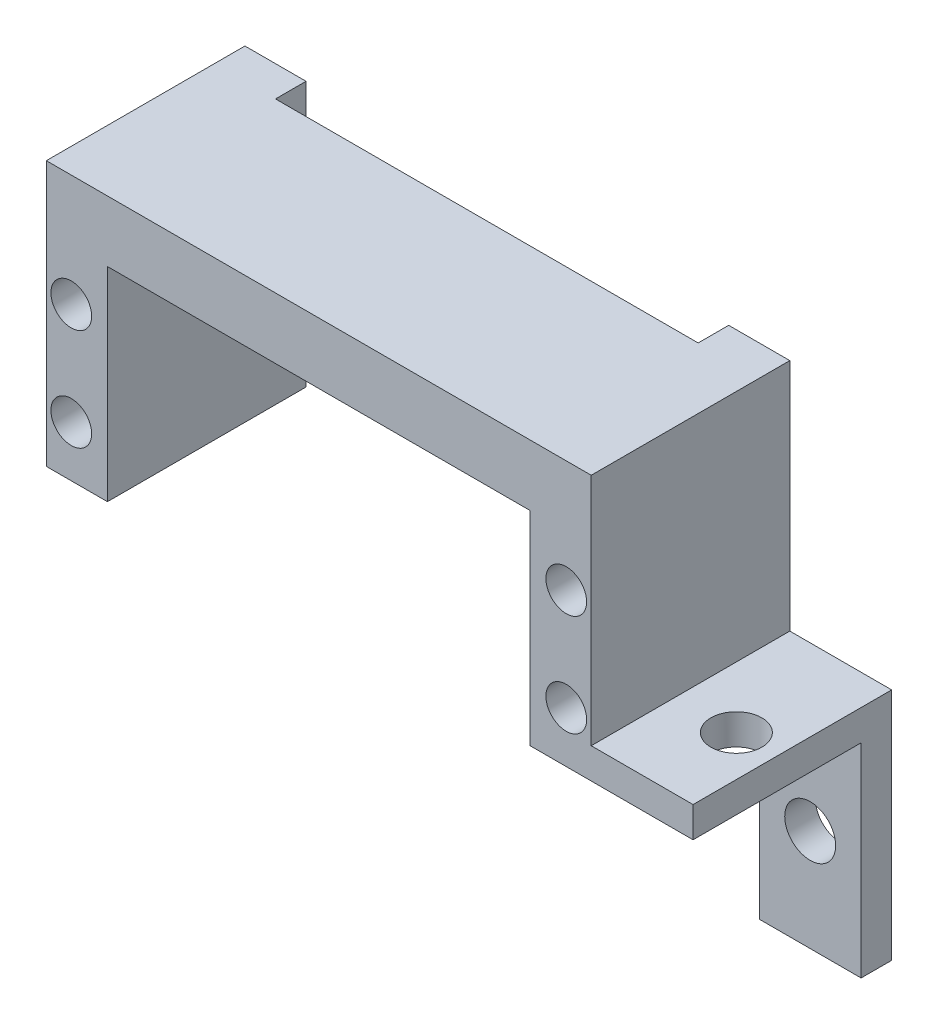
ISO-10303-21;
HEADER;
FILE_DESCRIPTION(('STEP AP214'),'2;1');
FILE_NAME('part.step','',(''),(''),'','','');
FILE_SCHEMA(('AUTOMOTIVE_DESIGN { 1 0 10303 214 1 1 1 1 }'));
ENDSEC;
DATA;
#1=APPLICATION_CONTEXT('core data for automotive mechanical design processes');
#2=APPLICATION_PROTOCOL_DEFINITION('international standard','automotive_design',2000,#1);
#3=PRODUCT_CONTEXT('',#1,'mechanical');
#4=PRODUCT('Part','Part','',(#3));
#5=PRODUCT_RELATED_PRODUCT_CATEGORY('part','',(#4));
#6=PRODUCT_DEFINITION_FORMATION('','',#4);
#7=PRODUCT_DEFINITION_CONTEXT('part definition',#1,'design');
#8=PRODUCT_DEFINITION('design','',#6,#7);
#9=PRODUCT_DEFINITION_SHAPE('','',#8);
#10=(LENGTH_UNIT() NAMED_UNIT(*) SI_UNIT(.MILLI.,.METRE.));
#11=(NAMED_UNIT(*) PLANE_ANGLE_UNIT() SI_UNIT($,.RADIAN.));
#12=(NAMED_UNIT(*) SI_UNIT($,.STERADIAN.) SOLID_ANGLE_UNIT());
#13=UNCERTAINTY_MEASURE_WITH_UNIT(LENGTH_MEASURE(1.E-05),#10,'distance_accuracy_value','');
#14=(GEOMETRIC_REPRESENTATION_CONTEXT(3) GLOBAL_UNCERTAINTY_ASSIGNED_CONTEXT((#13)) GLOBAL_UNIT_ASSIGNED_CONTEXT((#10,
#11,#12)) REPRESENTATION_CONTEXT('',''));
#15=CARTESIAN_POINT('',(0.,0.,0.));
#16=DIRECTION('',(0.,0.,1.));
#17=DIRECTION('',(1.,0.,0.));
#18=AXIS2_PLACEMENT_3D('',#15,#16,#17);
#19=CARTESIAN_POINT('',(0.,0.,0.));
#20=DIRECTION('',(0.,0.,1.));
#21=DIRECTION('',(1.,0.,0.));
#22=AXIS2_PLACEMENT_3D('',#19,#20,#21);
#23=PLANE('',#22);
#24=DIRECTION('',(0.,1.,0.));
#25=VECTOR('',#24,1.);
#26=CARTESIAN_POINT('',(20.75,-26.,0.));
#27=LINE('',#26,#25);
#28=CARTESIAN_POINT('',(20.75,-6.,0.));
#29=VERTEX_POINT('',#28);
#30=CARTESIAN_POINT('',(20.75,0.,0.));
#31=VERTEX_POINT('',#30);
#32=EDGE_CURVE('E529',#29,#31,#27,.T.);
#33=ORIENTED_EDGE('',*,*,#32,.F.);
#34=DIRECTION('',(1.,0.,0.));
#35=VECTOR('',#34,1.);
#36=CARTESIAN_POINT('',(0.,-6.,0.));
#37=LINE('',#36,#35);
#38=CARTESIAN_POINT('',(-20.75,-6.,0.));
#39=VERTEX_POINT('',#38);
#40=EDGE_CURVE('E112',#39,#29,#37,.T.);
#41=ORIENTED_EDGE('',*,*,#40,.F.);
#42=DIRECTION('',(0.,-1.,0.));
#43=VECTOR('',#42,1.);
#44=CARTESIAN_POINT('',(-20.75,0.,0.));
#45=LINE('',#44,#43);
#46=CARTESIAN_POINT('',(-20.75,0.,0.));
#47=VERTEX_POINT('',#46);
#48=EDGE_CURVE('E65',#47,#39,#45,.T.);
#49=ORIENTED_EDGE('',*,*,#48,.F.);
#50=DIRECTION('',(-1.,0.,0.));
#51=VECTOR('',#50,1.);
#52=CARTESIAN_POINT('',(0.,0.,0.));
#53=LINE('',#52,#51);
#54=EDGE_CURVE('E128',#31,#47,#53,.T.);
#55=ORIENTED_EDGE('',*,*,#54,.F.);
#56=EDGE_LOOP('',(#33,#41,#49,#55));
#57=FACE_BOUND('',#56,.T.);
#58=ADVANCED_FACE('F35',(#57),#23,.F.);
#59=CARTESIAN_POINT('',(26.75,-23.,-3.));
#60=DIRECTION('',(1.,0.,0.));
#61=DIRECTION('',(0.,1.,0.));
#62=AXIS2_PLACEMENT_3D('',#59,#60,#61);
#63=PLANE('',#62);
#64=DIRECTION('',(0.,0.,1.));
#65=VECTOR('',#64,1.);
#66=CARTESIAN_POINT('',(26.75,-26.,-3.));
#67=LINE('',#66,#65);
#68=CARTESIAN_POINT('',(26.75,-26.,-3.));
#69=VERTEX_POINT('',#68);
#70=CARTESIAN_POINT('',(26.75,-26.,0.));
#71=VERTEX_POINT('',#70);
#72=EDGE_CURVE('E548',#69,#71,#67,.T.);
#73=ORIENTED_EDGE('',*,*,#72,.F.);
#74=DIRECTION('',(0.,1.,0.));
#75=VECTOR('',#74,1.);
#76=CARTESIAN_POINT('',(26.75,-23.,-3.));
#77=LINE('',#76,#75);
#78=CARTESIAN_POINT('',(26.75,-46.,-3.));
#79=VERTEX_POINT('',#78);
#80=EDGE_CURVE('E190',#79,#69,#77,.T.);
#81=ORIENTED_EDGE('',*,*,#80,.F.);
#82=DIRECTION('',(0.,0.,1.));
#83=VECTOR('',#82,1.);
#84=CARTESIAN_POINT('',(26.75,-46.,-3.));
#85=LINE('',#84,#83);
#86=CARTESIAN_POINT('',(26.75,-46.,0.));
#87=VERTEX_POINT('',#86);
#88=EDGE_CURVE('E203',#79,#87,#85,.T.);
#89=ORIENTED_EDGE('',*,*,#88,.T.);
#90=DIRECTION('',(0.,1.,0.));
#91=VECTOR('',#90,1.);
#92=CARTESIAN_POINT('',(26.75,-23.,0.));
#93=LINE('',#92,#91);
#94=EDGE_CURVE('E187',#87,#71,#93,.T.);
#95=ORIENTED_EDGE('',*,*,#94,.T.);
#96=EDGE_LOOP('',(#73,#81,#89,#95));
#97=FACE_BOUND('',#96,.T.);
#98=ADVANCED_FACE('F260',(#97),#63,.F.);
#99=CARTESIAN_POINT('',(26.75,0.,16.5));
#100=DIRECTION('',(-1.,0.,0.));
#101=DIRECTION('',(0.,-1.,0.));
#102=AXIS2_PLACEMENT_3D('',#99,#100,#101);
#103=PLANE('',#102);
#104=DIRECTION('',(0.,0.,1.));
#105=VECTOR('',#104,1.);
#106=CARTESIAN_POINT('',(26.75,-23.,0.));
#107=LINE('',#106,#105);
#108=CARTESIAN_POINT('',(26.75,-23.,-3.));
#109=VERTEX_POINT('',#108);
#110=CARTESIAN_POINT('',(26.75,-23.,16.5));
#111=VERTEX_POINT('',#110);
#112=EDGE_CURVE('E233',#109,#111,#107,.T.);
#113=ORIENTED_EDGE('',*,*,#112,.F.);
#114=DIRECTION('',(0.,-1.,0.));
#115=VECTOR('',#114,1.);
#116=CARTESIAN_POINT('',(26.75,-26.,-3.));
#117=LINE('',#116,#115);
#118=CARTESIAN_POINT('',(26.75,0.,-3.));
#119=VERTEX_POINT('',#118);
#120=EDGE_CURVE('E543',#119,#109,#117,.T.);
#121=ORIENTED_EDGE('',*,*,#120,.F.);
#122=DIRECTION('',(0.,0.,-1.));
#123=VECTOR('',#122,1.);
#124=CARTESIAN_POINT('',(26.75,0.,16.5));
#125=LINE('',#124,#123);
#126=CARTESIAN_POINT('',(26.75,0.,16.5));
#127=VERTEX_POINT('',#126);
#128=EDGE_CURVE('E11',#127,#119,#125,.T.);
#129=ORIENTED_EDGE('',*,*,#128,.F.);
#130=DIRECTION('',(0.,1.,0.));
#131=VECTOR('',#130,1.);
#132=CARTESIAN_POINT('',(26.75,0.,16.5));
#133=LINE('',#132,#131);
#134=EDGE_CURVE('E135',#111,#127,#133,.T.);
#135=ORIENTED_EDGE('',*,*,#134,.F.);
#136=EDGE_LOOP('',(#113,#121,#129,#135));
#137=FACE_BOUND('',#136,.T.);
#138=ADVANCED_FACE('F37',(#137),#103,.F.);
#139=CARTESIAN_POINT('',(0.,0.,16.5));
#140=DIRECTION('',(0.,-1.,0.));
#141=DIRECTION('',(0.,0.,-1.));
#142=AXIS2_PLACEMENT_3D('',#139,#140,#141);
#143=PLANE('',#142);
#144=ORIENTED_EDGE('',*,*,#128,.T.);
#145=DIRECTION('',(1.,0.,0.));
#146=VECTOR('',#145,1.);
#147=CARTESIAN_POINT('',(20.75,0.,-3.));
#148=LINE('',#147,#146);
#149=CARTESIAN_POINT('',(20.75,0.,-3.));
#150=VERTEX_POINT('',#149);
#151=EDGE_CURVE('E540',#150,#119,#148,.T.);
#152=ORIENTED_EDGE('',*,*,#151,.F.);
#153=DIRECTION('',(0.,0.,1.));
#154=VECTOR('',#153,1.);
#155=CARTESIAN_POINT('',(20.75,0.,-3.));
#156=LINE('',#155,#154);
#157=EDGE_CURVE('E552',#150,#31,#156,.T.);
#158=ORIENTED_EDGE('',*,*,#157,.T.);
#159=ORIENTED_EDGE('',*,*,#54,.T.);
#160=DIRECTION('',(0.,0.,1.));
#161=VECTOR('',#160,1.);
#162=CARTESIAN_POINT('',(-20.75,0.,-3.));
#163=LINE('',#162,#161);
#164=CARTESIAN_POINT('',(-20.75,0.,-3.));
#165=VERTEX_POINT('',#164);
#166=EDGE_CURVE('E164',#165,#47,#163,.T.);
#167=ORIENTED_EDGE('',*,*,#166,.F.);
#168=DIRECTION('',(1.,0.,0.));
#169=VECTOR('',#168,1.);
#170=CARTESIAN_POINT('',(-26.75,0.,-3.));
#171=LINE('',#170,#169);
#172=CARTESIAN_POINT('',(-26.75,0.,-3.));
#173=VERTEX_POINT('',#172);
#174=EDGE_CURVE('E162',#173,#165,#171,.T.);
#175=ORIENTED_EDGE('',*,*,#174,.F.);
#176=DIRECTION('',(0.,0.,-1.));
#177=VECTOR('',#176,1.);
#178=CARTESIAN_POINT('',(-26.75,0.,16.5));
#179=LINE('',#178,#177);
#180=CARTESIAN_POINT('',(-26.75,0.,16.5));
#181=VERTEX_POINT('',#180);
#182=EDGE_CURVE('E45',#181,#173,#179,.T.);
#183=ORIENTED_EDGE('',*,*,#182,.F.);
#184=DIRECTION('',(-1.,0.,0.));
#185=VECTOR('',#184,1.);
#186=CARTESIAN_POINT('',(0.,0.,16.5));
#187=LINE('',#186,#185);
#188=EDGE_CURVE('E240',#127,#181,#187,.T.);
#189=ORIENTED_EDGE('',*,*,#188,.F.);
#190=EDGE_LOOP('',(#144,#152,#158,#159,#167,#175,#183,#189));
#191=FACE_BOUND('',#190,.T.);
#192=ADVANCED_FACE('F163',(#191),#143,.F.);
#193=CARTESIAN_POINT('',(-26.75,0.,16.5));
#194=DIRECTION('',(1.,0.,0.));
#195=DIRECTION('',(0.,1.,0.));
#196=AXIS2_PLACEMENT_3D('',#193,#194,#195);
#197=PLANE('',#196);
#198=ORIENTED_EDGE('',*,*,#182,.T.);
#199=DIRECTION('',(0.,1.,0.));
#200=VECTOR('',#199,1.);
#201=CARTESIAN_POINT('',(-26.75,0.,-3.));
#202=LINE('',#201,#200);
#203=CARTESIAN_POINT('',(-26.75,-26.,-3.));
#204=VERTEX_POINT('',#203);
#205=EDGE_CURVE('E154',#204,#173,#202,.T.);
#206=ORIENTED_EDGE('',*,*,#205,.F.);
#207=DIRECTION('',(0.,0.,-1.));
#208=VECTOR('',#207,1.);
#209=CARTESIAN_POINT('',(-26.75,-26.,16.5));
#210=LINE('',#209,#208);
#211=CARTESIAN_POINT('',(-26.75,-26.,16.5));
#212=VERTEX_POINT('',#211);
#213=EDGE_CURVE('E228',#212,#204,#210,.T.);
#214=ORIENTED_EDGE('',*,*,#213,.F.);
#215=DIRECTION('',(0.,-1.,0.));
#216=VECTOR('',#215,1.);
#217=CARTESIAN_POINT('',(-26.75,0.,16.5));
#218=LINE('',#217,#216);
#219=EDGE_CURVE('E155',#181,#212,#218,.T.);
#220=ORIENTED_EDGE('',*,*,#219,.F.);
#221=EDGE_LOOP('',(#198,#206,#214,#220));
#222=FACE_BOUND('',#221,.T.);
#223=ADVANCED_FACE('F150',(#222),#197,.F.);
#224=CARTESIAN_POINT('',(-20.75,-26.,16.5));
#225=DIRECTION('',(0.,1.,0.));
#226=DIRECTION('',(0.,0.,1.));
#227=AXIS2_PLACEMENT_3D('',#224,#225,#226);
#228=PLANE('',#227);
#229=ORIENTED_EDGE('',*,*,#213,.T.);
#230=DIRECTION('',(1.,0.,0.));
#231=VECTOR('',#230,1.);
#232=CARTESIAN_POINT('',(-20.75,-26.,-3.));
#233=LINE('',#232,#231);
#234=CARTESIAN_POINT('',(-20.75,-26.,-3.));
#235=VERTEX_POINT('',#234);
#236=EDGE_CURVE('E174',#204,#235,#233,.T.);
#237=ORIENTED_EDGE('',*,*,#236,.T.);
#238=DIRECTION('',(0.,0.,-1.));
#239=VECTOR('',#238,1.);
#240=CARTESIAN_POINT('',(-20.75,-26.,16.5));
#241=LINE('',#240,#239);
#242=CARTESIAN_POINT('',(-20.75,-26.,16.5));
#243=VERTEX_POINT('',#242);
#244=EDGE_CURVE('E140',#243,#235,#241,.T.);
#245=ORIENTED_EDGE('',*,*,#244,.F.);
#246=DIRECTION('',(1.,0.,0.));
#247=VECTOR('',#246,1.);
#248=CARTESIAN_POINT('',(-20.75,-26.,16.5));
#249=LINE('',#248,#247);
#250=EDGE_CURVE('E243',#212,#243,#249,.T.);
#251=ORIENTED_EDGE('',*,*,#250,.F.);
#252=EDGE_LOOP('',(#229,#237,#245,#251));
#253=FACE_BOUND('',#252,.T.);
#254=ADVANCED_FACE('F247',(#253),#228,.F.);
#255=CARTESIAN_POINT('',(-20.75,-6.,16.5));
#256=DIRECTION('',(-1.,0.,0.));
#257=DIRECTION('',(0.,-1.,0.));
#258=AXIS2_PLACEMENT_3D('',#255,#256,#257);
#259=PLANE('',#258);
#260=ORIENTED_EDGE('',*,*,#244,.T.);
#261=DIRECTION('',(0.,-1.,0.));
#262=VECTOR('',#261,1.);
#263=CARTESIAN_POINT('',(-20.75,0.,-3.));
#264=LINE('',#263,#262);
#265=EDGE_CURVE('E168',#165,#235,#264,.T.);
#266=ORIENTED_EDGE('',*,*,#265,.F.);
#267=ORIENTED_EDGE('',*,*,#166,.T.);
#268=ORIENTED_EDGE('',*,*,#48,.T.);
#269=DIRECTION('',(0.,0.,-1.));
#270=VECTOR('',#269,1.);
#271=CARTESIAN_POINT('',(-20.75,-6.,16.5));
#272=LINE('',#271,#270);
#273=CARTESIAN_POINT('',(-20.75,-6.,16.5));
#274=VERTEX_POINT('',#273);
#275=EDGE_CURVE('E115',#274,#39,#272,.T.);
#276=ORIENTED_EDGE('',*,*,#275,.F.);
#277=DIRECTION('',(0.,1.,0.));
#278=VECTOR('',#277,1.);
#279=CARTESIAN_POINT('',(-20.75,-6.,16.5));
#280=LINE('',#279,#278);
#281=EDGE_CURVE('E103',#243,#274,#280,.T.);
#282=ORIENTED_EDGE('',*,*,#281,.F.);
#283=EDGE_LOOP('',(#260,#266,#267,#268,#276,#282));
#284=FACE_BOUND('',#283,.T.);
#285=ADVANCED_FACE('F249',(#284),#259,.F.);
#286=CARTESIAN_POINT('',(0.,-6.,16.5));
#287=DIRECTION('',(0.,1.,0.));
#288=DIRECTION('',(0.,0.,1.));
#289=AXIS2_PLACEMENT_3D('',#286,#287,#288);
#290=PLANE('',#289);
#291=ORIENTED_EDGE('',*,*,#40,.T.);
#292=DIRECTION('',(0.,0.,-1.));
#293=VECTOR('',#292,1.);
#294=CARTESIAN_POINT('',(20.75,-6.,16.5));
#295=LINE('',#294,#293);
#296=CARTESIAN_POINT('',(20.75,-6.,16.5));
#297=VERTEX_POINT('',#296);
#298=EDGE_CURVE('E109',#297,#29,#295,.T.);
#299=ORIENTED_EDGE('',*,*,#298,.F.);
#300=DIRECTION('',(1.,0.,0.));
#301=VECTOR('',#300,1.);
#302=CARTESIAN_POINT('',(0.,-6.,16.5));
#303=LINE('',#302,#301);
#304=EDGE_CURVE('E95',#274,#297,#303,.T.);
#305=ORIENTED_EDGE('',*,*,#304,.F.);
#306=ORIENTED_EDGE('',*,*,#275,.T.);
#307=EDGE_LOOP('',(#291,#299,#305,#306));
#308=FACE_BOUND('',#307,.T.);
#309=ADVANCED_FACE('F110',(#308),#290,.F.);
#310=CARTESIAN_POINT('',(20.75,-6.,16.5));
#311=DIRECTION('',(1.,0.,0.));
#312=DIRECTION('',(0.,1.,0.));
#313=AXIS2_PLACEMENT_3D('',#310,#311,#312);
#314=PLANE('',#313);
#315=ORIENTED_EDGE('',*,*,#298,.T.);
#316=ORIENTED_EDGE('',*,*,#32,.T.);
#317=ORIENTED_EDGE('',*,*,#157,.F.);
#318=DIRECTION('',(0.,1.,0.));
#319=VECTOR('',#318,1.);
#320=CARTESIAN_POINT('',(20.75,-26.,-3.));
#321=LINE('',#320,#319);
#322=CARTESIAN_POINT('',(20.75,-26.,-3.));
#323=VERTEX_POINT('',#322);
#324=EDGE_CURVE('E532',#323,#150,#321,.T.);
#325=ORIENTED_EDGE('',*,*,#324,.F.);
#326=DIRECTION('',(0.,0.,-1.));
#327=VECTOR('',#326,1.);
#328=CARTESIAN_POINT('',(20.75,-26.,16.5));
#329=LINE('',#328,#327);
#330=CARTESIAN_POINT('',(20.75,-26.,16.5));
#331=VERTEX_POINT('',#330);
#332=EDGE_CURVE('E116',#331,#323,#329,.T.);
#333=ORIENTED_EDGE('',*,*,#332,.F.);
#334=DIRECTION('',(0.,-1.,0.));
#335=VECTOR('',#334,1.);
#336=CARTESIAN_POINT('',(20.75,-6.,16.5));
#337=LINE('',#336,#335);
#338=EDGE_CURVE('E100',#297,#331,#337,.T.);
#339=ORIENTED_EDGE('',*,*,#338,.F.);
#340=EDGE_LOOP('',(#315,#316,#317,#325,#333,#339));
#341=FACE_BOUND('',#340,.T.);
#342=ADVANCED_FACE('F118',(#341),#314,.F.);
#343=CARTESIAN_POINT('',(20.75,-26.,16.5));
#344=DIRECTION('',(0.,1.,0.));
#345=DIRECTION('',(0.,0.,1.));
#346=AXIS2_PLACEMENT_3D('',#343,#344,#345);
#347=PLANE('',#346);
#348=CARTESIAN_POINT('',(32.75,-26.,8.25));
#349=DIRECTION('',(0.,1.,0.));
#350=DIRECTION('',(0.,0.,1.));
#351=AXIS2_PLACEMENT_3D('',#348,#349,#350);
#352=CIRCLE('',#351,2.5);
#353=CARTESIAN_POINT('',(32.75,-26.,10.75));
#354=VERTEX_POINT('',#353);
#355=EDGE_CURVE('E131',#354,#354,#352,.T.);
#356=ORIENTED_EDGE('',*,*,#355,.T.);
#357=EDGE_LOOP('',(#356));
#358=FACE_BOUND('',#357,.T.);
#359=ORIENTED_EDGE('',*,*,#332,.T.);
#360=DIRECTION('',(-1.,0.,0.));
#361=VECTOR('',#360,1.);
#362=CARTESIAN_POINT('',(20.75,-26.,-3.));
#363=LINE('',#362,#361);
#364=EDGE_CURVE('E546',#69,#323,#363,.T.);
#365=ORIENTED_EDGE('',*,*,#364,.F.);
#366=ORIENTED_EDGE('',*,*,#72,.T.);
#367=DIRECTION('',(1.,0.,0.));
#368=VECTOR('',#367,1.);
#369=CARTESIAN_POINT('',(20.75,-26.,0.));
#370=LINE('',#369,#368);
#371=CARTESIAN_POINT('',(36.75,-26.,0.));
#372=VERTEX_POINT('',#371);
#373=EDGE_CURVE('E133',#71,#372,#370,.T.);
#374=ORIENTED_EDGE('',*,*,#373,.T.);
#375=DIRECTION('',(0.,0.,-1.));
#376=VECTOR('',#375,1.);
#377=CARTESIAN_POINT('',(36.75,-26.,16.5));
#378=LINE('',#377,#376);
#379=CARTESIAN_POINT('',(36.75,-26.,16.5));
#380=VERTEX_POINT('',#379);
#381=EDGE_CURVE('E127',#380,#372,#378,.T.);
#382=ORIENTED_EDGE('',*,*,#381,.F.);
#383=DIRECTION('',(1.,0.,0.));
#384=VECTOR('',#383,1.);
#385=CARTESIAN_POINT('',(20.75,-26.,16.5));
#386=LINE('',#385,#384);
#387=EDGE_CURVE('E53',#331,#380,#386,.T.);
#388=ORIENTED_EDGE('',*,*,#387,.F.);
#389=EDGE_LOOP('',(#359,#365,#366,#374,#382,#388));
#390=FACE_BOUND('',#389,.T.);
#391=ADVANCED_FACE('F276',(#358,#390),#347,.F.);
#392=CARTESIAN_POINT('',(36.75,-20.,16.5));
#393=DIRECTION('',(-1.,0.,0.));
#394=DIRECTION('',(0.,0.,1.));
#395=AXIS2_PLACEMENT_3D('',#392,#393,#394);
#396=PLANE('',#395);
#397=ORIENTED_EDGE('',*,*,#381,.T.);
#398=DIRECTION('',(0.,-1.,0.));
#399=VECTOR('',#398,1.);
#400=CARTESIAN_POINT('',(36.75,-23.,0.));
#401=LINE('',#400,#399);
#402=CARTESIAN_POINT('',(36.75,-46.,0.));
#403=VERTEX_POINT('',#402);
#404=EDGE_CURVE('E206',#372,#403,#401,.T.);
#405=ORIENTED_EDGE('',*,*,#404,.T.);
#406=DIRECTION('',(0.,0.,1.));
#407=VECTOR('',#406,1.);
#408=CARTESIAN_POINT('',(36.75,-46.,-3.));
#409=LINE('',#408,#407);
#410=CARTESIAN_POINT('',(36.75,-46.,-3.));
#411=VERTEX_POINT('',#410);
#412=EDGE_CURVE('E213',#411,#403,#409,.T.);
#413=ORIENTED_EDGE('',*,*,#412,.F.);
#414=DIRECTION('',(0.,-1.,0.));
#415=VECTOR('',#414,1.);
#416=CARTESIAN_POINT('',(36.75,-23.,-3.));
#417=LINE('',#416,#415);
#418=CARTESIAN_POINT('',(36.75,-23.,-3.));
#419=VERTEX_POINT('',#418);
#420=EDGE_CURVE('E197',#419,#411,#417,.T.);
#421=ORIENTED_EDGE('',*,*,#420,.F.);
#422=DIRECTION('',(0.,0.,-1.));
#423=VECTOR('',#422,1.);
#424=CARTESIAN_POINT('',(36.75,-23.,0.));
#425=LINE('',#424,#423);
#426=CARTESIAN_POINT('',(36.75,-23.,16.5));
#427=VERTEX_POINT('',#426);
#428=EDGE_CURVE('E231',#427,#419,#425,.T.);
#429=ORIENTED_EDGE('',*,*,#428,.F.);
#430=DIRECTION('',(0.,1.,0.));
#431=VECTOR('',#430,1.);
#432=CARTESIAN_POINT('',(36.75,-20.,16.5));
#433=LINE('',#432,#431);
#434=EDGE_CURVE('E122',#380,#427,#433,.T.);
#435=ORIENTED_EDGE('',*,*,#434,.F.);
#436=EDGE_LOOP('',(#397,#405,#413,#421,#429,#435));
#437=FACE_BOUND('',#436,.T.);
#438=ADVANCED_FACE('F273',(#437),#396,.F.);
#439=CARTESIAN_POINT('',(0.,0.,16.5));
#440=DIRECTION('',(0.,0.,1.));
#441=DIRECTION('',(1.,0.,0.));
#442=AXIS2_PLACEMENT_3D('',#439,#440,#441);
#443=PLANE('',#442);
#444=CARTESIAN_POINT('',(24.3,-21.,16.5));
#445=DIRECTION('',(0.,0.,-1.));
#446=DIRECTION('',(-1.,0.,0.));
#447=AXIS2_PLACEMENT_3D('',#444,#445,#446);
#448=CIRCLE('',#447,2.);
#449=CARTESIAN_POINT('',(22.3,-21.,16.5));
#450=VERTEX_POINT('',#449);
#451=EDGE_CURVE('E217',#450,#450,#448,.T.);
#452=ORIENTED_EDGE('',*,*,#451,.T.);
#453=EDGE_LOOP('',(#452));
#454=FACE_BOUND('',#453,.T.);
#455=CARTESIAN_POINT('',(-24.3,-21.,16.5));
#456=DIRECTION('',(0.,0.,-1.));
#457=DIRECTION('',(1.,0.,0.));
#458=AXIS2_PLACEMENT_3D('',#455,#456,#457);
#459=CIRCLE('',#458,2.);
#460=CARTESIAN_POINT('',(-22.3,-21.,16.5));
#461=VERTEX_POINT('',#460);
#462=EDGE_CURVE('E221',#461,#461,#459,.T.);
#463=ORIENTED_EDGE('',*,*,#462,.T.);
#464=EDGE_LOOP('',(#463));
#465=FACE_BOUND('',#464,.T.);
#466=CARTESIAN_POINT('',(-24.3,-11.,16.5));
#467=DIRECTION('',(0.,0.,-1.));
#468=DIRECTION('',(1.,0.,0.));
#469=AXIS2_PLACEMENT_3D('',#466,#467,#468);
#470=CIRCLE('',#469,2.);
#471=CARTESIAN_POINT('',(-22.3,-11.,16.5));
#472=VERTEX_POINT('',#471);
#473=EDGE_CURVE('E216',#472,#472,#470,.T.);
#474=ORIENTED_EDGE('',*,*,#473,.T.);
#475=EDGE_LOOP('',(#474));
#476=FACE_BOUND('',#475,.T.);
#477=CARTESIAN_POINT('',(24.3,-11.,16.5));
#478=DIRECTION('',(0.,0.,-1.));
#479=DIRECTION('',(-1.,0.,0.));
#480=AXIS2_PLACEMENT_3D('',#477,#478,#479);
#481=CIRCLE('',#480,2.);
#482=CARTESIAN_POINT('',(22.3,-11.,16.5));
#483=VERTEX_POINT('',#482);
#484=EDGE_CURVE('E220',#483,#483,#481,.T.);
#485=ORIENTED_EDGE('',*,*,#484,.T.);
#486=EDGE_LOOP('',(#485));
#487=FACE_BOUND('',#486,.T.);
#488=ORIENTED_EDGE('',*,*,#219,.T.);
#489=ORIENTED_EDGE('',*,*,#250,.T.);
#490=ORIENTED_EDGE('',*,*,#281,.T.);
#491=ORIENTED_EDGE('',*,*,#304,.T.);
#492=ORIENTED_EDGE('',*,*,#338,.T.);
#493=ORIENTED_EDGE('',*,*,#387,.T.);
#494=ORIENTED_EDGE('',*,*,#434,.T.);
#495=DIRECTION('',(1.,0.,0.));
#496=VECTOR('',#495,1.);
#497=CARTESIAN_POINT('',(36.75,-23.,16.5));
#498=LINE('',#497,#496);
#499=EDGE_CURVE('E76',#111,#427,#498,.T.);
#500=ORIENTED_EDGE('',*,*,#499,.F.);
#501=ORIENTED_EDGE('',*,*,#134,.T.);
#502=ORIENTED_EDGE('',*,*,#188,.T.);
#503=EDGE_LOOP('',(#488,#489,#490,#491,#492,#493,#494,#500,#501,#502));
#504=FACE_BOUND('',#503,.T.);
#505=ADVANCED_FACE('F98',(#454,#465,#476,#487,#504),#443,.T.);
#506=CARTESIAN_POINT('',(32.75,-36.5,8.25));
#507=DIRECTION('',(0.,1.,0.));
#508=DIRECTION('',(0.,0.,1.));
#509=AXIS2_PLACEMENT_3D('',#506,#507,#508);
#510=CYLINDRICAL_SURFACE('',#509,2.5);
#511=CARTESIAN_POINT('',(32.75,-23.,8.25));
#512=DIRECTION('',(0.,-1.,0.));
#513=DIRECTION('',(0.,0.,-1.));
#514=AXIS2_PLACEMENT_3D('',#511,#512,#513);
#515=CIRCLE('',#514,2.5);
#516=CARTESIAN_POINT('',(32.75,-23.,5.75));
#517=VERTEX_POINT('',#516);
#518=EDGE_CURVE('E39',#517,#517,#515,.F.);
#519=ORIENTED_EDGE('',*,*,#518,.T.);
#520=EDGE_LOOP('',(#519));
#521=FACE_BOUND('',#520,.T.);
#522=ORIENTED_EDGE('',*,*,#355,.F.);
#523=EDGE_LOOP('',(#522));
#524=FACE_BOUND('',#523,.T.);
#525=ADVANCED_FACE('F409',(#521,#524),#510,.F.);
#526=CARTESIAN_POINT('',(0.,-23.,0.));
#527=DIRECTION('',(0.,-1.,0.));
#528=DIRECTION('',(0.,0.,-1.));
#529=AXIS2_PLACEMENT_3D('',#526,#527,#528);
#530=PLANE('',#529);
#531=ORIENTED_EDGE('',*,*,#428,.T.);
#532=DIRECTION('',(1.,0.,0.));
#533=VECTOR('',#532,1.);
#534=CARTESIAN_POINT('',(26.75,-23.,-3.));
#535=LINE('',#534,#533);
#536=EDGE_CURVE('E193',#109,#419,#535,.T.);
#537=ORIENTED_EDGE('',*,*,#536,.F.);
#538=ORIENTED_EDGE('',*,*,#112,.T.);
#539=ORIENTED_EDGE('',*,*,#499,.T.);
#540=EDGE_LOOP('',(#531,#537,#538,#539));
#541=FACE_BOUND('',#540,.T.);
#542=ORIENTED_EDGE('',*,*,#518,.F.);
#543=EDGE_LOOP('',(#542));
#544=FACE_BOUND('',#543,.T.);
#545=ADVANCED_FACE('F296',(#541,#544),#530,.F.);
#546=CARTESIAN_POINT('',(24.3,-11.,16.5));
#547=DIRECTION('',(0.,0.,-1.));
#548=DIRECTION('',(-1.,0.,0.));
#549=AXIS2_PLACEMENT_3D('',#546,#547,#548);
#550=CYLINDRICAL_SURFACE('',#549,2.);
#551=ORIENTED_EDGE('',*,*,#484,.F.);
#552=EDGE_LOOP('',(#551));
#553=FACE_BOUND('',#552,.T.);
#554=CARTESIAN_POINT('',(24.3,-11.,-3.));
#555=DIRECTION('',(0.,0.,-1.));
#556=DIRECTION('',(-1.,0.,0.));
#557=AXIS2_PLACEMENT_3D('',#554,#555,#556);
#558=CIRCLE('',#557,2.);
#559=CARTESIAN_POINT('',(22.3,-11.,-3.));
#560=VERTEX_POINT('',#559);
#561=EDGE_CURVE('E527',#560,#560,#558,.T.);
#562=ORIENTED_EDGE('',*,*,#561,.T.);
#563=EDGE_LOOP('',(#562));
#564=FACE_BOUND('',#563,.T.);
#565=ADVANCED_FACE('F291',(#553,#564),#550,.F.);
#566=CARTESIAN_POINT('',(-24.3,-11.,16.5));
#567=DIRECTION('',(0.,0.,-1.));
#568=DIRECTION('',(-1.,0.,0.));
#569=AXIS2_PLACEMENT_3D('',#566,#567,#568);
#570=CYLINDRICAL_SURFACE('',#569,2.);
#571=ORIENTED_EDGE('',*,*,#473,.F.);
#572=EDGE_LOOP('',(#571));
#573=FACE_BOUND('',#572,.T.);
#574=CARTESIAN_POINT('',(-24.3,-11.,-3.));
#575=DIRECTION('',(0.,0.,-1.));
#576=DIRECTION('',(-1.,0.,0.));
#577=AXIS2_PLACEMENT_3D('',#574,#575,#576);
#578=CIRCLE('',#577,2.);
#579=CARTESIAN_POINT('',(-26.3,-11.,-3.));
#580=VERTEX_POINT('',#579);
#581=EDGE_CURVE('E176',#580,#580,#578,.T.);
#582=ORIENTED_EDGE('',*,*,#581,.T.);
#583=EDGE_LOOP('',(#582));
#584=FACE_BOUND('',#583,.T.);
#585=ADVANCED_FACE('F295',(#573,#584),#570,.F.);
#586=CARTESIAN_POINT('',(-24.3,-21.,16.5));
#587=DIRECTION('',(0.,0.,-1.));
#588=DIRECTION('',(-1.,0.,0.));
#589=AXIS2_PLACEMENT_3D('',#586,#587,#588);
#590=CYLINDRICAL_SURFACE('',#589,2.);
#591=ORIENTED_EDGE('',*,*,#462,.F.);
#592=EDGE_LOOP('',(#591));
#593=FACE_BOUND('',#592,.T.);
#594=CARTESIAN_POINT('',(-24.3,-21.,-3.));
#595=DIRECTION('',(0.,0.,-1.));
#596=DIRECTION('',(-1.,0.,0.));
#597=AXIS2_PLACEMENT_3D('',#594,#595,#596);
#598=CIRCLE('',#597,2.);
#599=CARTESIAN_POINT('',(-26.3,-21.,-3.));
#600=VERTEX_POINT('',#599);
#601=EDGE_CURVE('E554',#600,#600,#598,.T.);
#602=ORIENTED_EDGE('',*,*,#601,.T.);
#603=EDGE_LOOP('',(#602));
#604=FACE_BOUND('',#603,.T.);
#605=ADVANCED_FACE('F304',(#593,#604),#590,.F.);
#606=CARTESIAN_POINT('',(24.3,-21.,16.5));
#607=DIRECTION('',(0.,0.,-1.));
#608=DIRECTION('',(-1.,0.,0.));
#609=AXIS2_PLACEMENT_3D('',#606,#607,#608);
#610=CYLINDRICAL_SURFACE('',#609,2.);
#611=ORIENTED_EDGE('',*,*,#451,.F.);
#612=EDGE_LOOP('',(#611));
#613=FACE_BOUND('',#612,.T.);
#614=CARTESIAN_POINT('',(24.3,-21.,-3.));
#615=DIRECTION('',(0.,0.,-1.));
#616=DIRECTION('',(-1.,0.,0.));
#617=AXIS2_PLACEMENT_3D('',#614,#615,#616);
#618=CIRCLE('',#617,2.);
#619=CARTESIAN_POINT('',(22.3,-21.,-3.));
#620=VERTEX_POINT('',#619);
#621=EDGE_CURVE('E530',#620,#620,#618,.T.);
#622=ORIENTED_EDGE('',*,*,#621,.T.);
#623=EDGE_LOOP('',(#622));
#624=FACE_BOUND('',#623,.T.);
#625=ADVANCED_FACE('F312',(#613,#624),#610,.F.);
#626=CARTESIAN_POINT('',(0.,0.,0.));
#627=DIRECTION('',(0.,0.,1.));
#628=DIRECTION('',(1.,0.,0.));
#629=AXIS2_PLACEMENT_3D('',#626,#627,#628);
#630=PLANE('',#629);
#631=CARTESIAN_POINT('',(31.75,-36.,0.));
#632=DIRECTION('',(0.,0.,-1.));
#633=DIRECTION('',(-1.,0.,0.));
#634=AXIS2_PLACEMENT_3D('',#631,#632,#633);
#635=CIRCLE('',#634,2.5);
#636=CARTESIAN_POINT('',(29.25,-36.,0.));
#637=VERTEX_POINT('',#636);
#638=EDGE_CURVE('E184',#637,#637,#635,.T.);
#639=ORIENTED_EDGE('',*,*,#638,.T.);
#640=EDGE_LOOP('',(#639));
#641=FACE_BOUND('',#640,.T.);
#642=ORIENTED_EDGE('',*,*,#373,.F.);
#643=ORIENTED_EDGE('',*,*,#94,.F.);
#644=DIRECTION('',(-1.,0.,0.));
#645=VECTOR('',#644,1.);
#646=CARTESIAN_POINT('',(26.75,-46.,0.));
#647=LINE('',#646,#645);
#648=EDGE_CURVE('E194',#403,#87,#647,.T.);
#649=ORIENTED_EDGE('',*,*,#648,.F.);
#650=ORIENTED_EDGE('',*,*,#404,.F.);
#651=EDGE_LOOP('',(#642,#643,#649,#650));
#652=FACE_BOUND('',#651,.T.);
#653=ADVANCED_FACE('F320',(#641,#652),#630,.T.);
#654=CARTESIAN_POINT('',(26.75,-46.,-3.));
#655=DIRECTION('',(0.,1.,0.));
#656=DIRECTION('',(-1.,0.,0.));
#657=AXIS2_PLACEMENT_3D('',#654,#655,#656);
#658=PLANE('',#657);
#659=ORIENTED_EDGE('',*,*,#648,.T.);
#660=ORIENTED_EDGE('',*,*,#88,.F.);
#661=DIRECTION('',(-1.,0.,0.));
#662=VECTOR('',#661,1.);
#663=CARTESIAN_POINT('',(26.75,-46.,-3.));
#664=LINE('',#663,#662);
#665=EDGE_CURVE('E200',#411,#79,#664,.T.);
#666=ORIENTED_EDGE('',*,*,#665,.F.);
#667=ORIENTED_EDGE('',*,*,#412,.T.);
#668=EDGE_LOOP('',(#659,#660,#666,#667));
#669=FACE_BOUND('',#668,.T.);
#670=ADVANCED_FACE('F331',(#669),#658,.F.);
#671=CARTESIAN_POINT('',(0.,0.,-3.));
#672=DIRECTION('',(0.,0.,1.));
#673=DIRECTION('',(1.,0.,0.));
#674=AXIS2_PLACEMENT_3D('',#671,#672,#673);
#675=PLANE('',#674);
#676=CARTESIAN_POINT('',(31.75,-36.,-3.));
#677=DIRECTION('',(0.,0.,-1.));
#678=DIRECTION('',(-1.,0.,0.));
#679=AXIS2_PLACEMENT_3D('',#676,#677,#678);
#680=CIRCLE('',#679,2.5);
#681=CARTESIAN_POINT('',(29.25,-36.,-3.));
#682=VERTEX_POINT('',#681);
#683=EDGE_CURVE('E183',#682,#682,#680,.T.);
#684=ORIENTED_EDGE('',*,*,#683,.F.);
#685=EDGE_LOOP('',(#684));
#686=FACE_BOUND('',#685,.T.);
#687=ORIENTED_EDGE('',*,*,#80,.T.);
#688=ORIENTED_EDGE('',*,*,#364,.T.);
#689=ORIENTED_EDGE('',*,*,#324,.T.);
#690=ORIENTED_EDGE('',*,*,#151,.T.);
#691=ORIENTED_EDGE('',*,*,#120,.T.);
#692=ORIENTED_EDGE('',*,*,#536,.T.);
#693=ORIENTED_EDGE('',*,*,#420,.T.);
#694=ORIENTED_EDGE('',*,*,#665,.T.);
#695=EDGE_LOOP('',(#687,#688,#689,#690,#691,#692,#693,#694));
#696=FACE_BOUND('',#695,.T.);
#697=ORIENTED_EDGE('',*,*,#561,.F.);
#698=EDGE_LOOP('',(#697));
#699=FACE_BOUND('',#698,.T.);
#700=ORIENTED_EDGE('',*,*,#621,.F.);
#701=EDGE_LOOP('',(#700));
#702=FACE_BOUND('',#701,.T.);
#703=ADVANCED_FACE('F326',(#686,#696,#699,#702),#675,.F.);
#704=CARTESIAN_POINT('',(31.75,-36.,0.));
#705=DIRECTION('',(0.,0.,-1.));
#706=DIRECTION('',(-1.,0.,0.));
#707=AXIS2_PLACEMENT_3D('',#704,#705,#706);
#708=CYLINDRICAL_SURFACE('',#707,2.5);
#709=ORIENTED_EDGE('',*,*,#638,.F.);
#710=EDGE_LOOP('',(#709));
#711=FACE_BOUND('',#710,.T.);
#712=ORIENTED_EDGE('',*,*,#683,.T.);
#713=EDGE_LOOP('',(#712));
#714=FACE_BOUND('',#713,.T.);
#715=ADVANCED_FACE('F330',(#711,#714),#708,.F.);
#716=CARTESIAN_POINT('',(0.,0.,-3.));
#717=DIRECTION('',(0.,0.,-1.));
#718=DIRECTION('',(-1.,0.,0.));
#719=AXIS2_PLACEMENT_3D('',#716,#717,#718);
#720=PLANE('',#719);
#721=ORIENTED_EDGE('',*,*,#236,.F.);
#722=ORIENTED_EDGE('',*,*,#205,.T.);
#723=ORIENTED_EDGE('',*,*,#174,.T.);
#724=ORIENTED_EDGE('',*,*,#265,.T.);
#725=EDGE_LOOP('',(#721,#722,#723,#724));
#726=FACE_BOUND('',#725,.T.);
#727=ORIENTED_EDGE('',*,*,#581,.F.);
#728=EDGE_LOOP('',(#727));
#729=FACE_BOUND('',#728,.T.);
#730=ORIENTED_EDGE('',*,*,#601,.F.);
#731=EDGE_LOOP('',(#730));
#732=FACE_BOUND('',#731,.T.);
#733=ADVANCED_FACE('F171',(#726,#729,#732),#720,.T.);
#734=CLOSED_SHELL('',(#58,#98,#138,#192,#223,#254,#285,#309,#342,#391,#438,#505,#525,#545,#565,
#585,#605,#625,#653,#670,#703,#715,#733));
#735=MANIFOLD_SOLID_BREP('B2',#734);
#736=ADVANCED_BREP_SHAPE_REPRESENTATION('',(#18,#735),#14);
#737=SHAPE_DEFINITION_REPRESENTATION(#9,#736);
ENDSEC;
END-ISO-10303-21;
